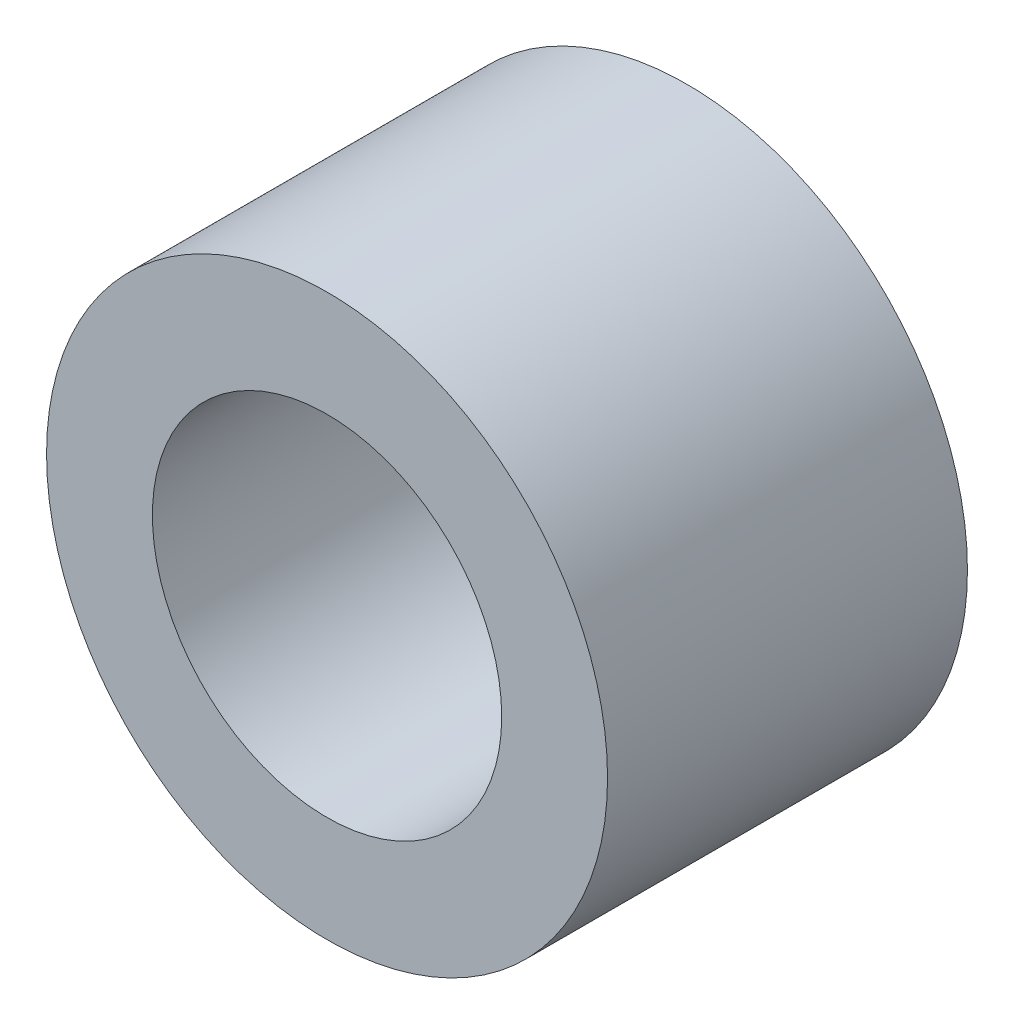
ISO-10303-21;
HEADER;
FILE_DESCRIPTION(('STEP AP214'),'2;1');
FILE_NAME('part.step','',(''),(''),'','','');
FILE_SCHEMA(('AUTOMOTIVE_DESIGN { 1 0 10303 214 1 1 1 1 }'));
ENDSEC;
DATA;
#1=APPLICATION_CONTEXT('core data for automotive mechanical design processes');
#2=APPLICATION_PROTOCOL_DEFINITION('international standard','automotive_design',2000,#1);
#3=PRODUCT_CONTEXT('',#1,'mechanical');
#4=PRODUCT('Part','Part','',(#3));
#5=PRODUCT_RELATED_PRODUCT_CATEGORY('part','',(#4));
#6=PRODUCT_DEFINITION_FORMATION('','',#4);
#7=PRODUCT_DEFINITION_CONTEXT('part definition',#1,'design');
#8=PRODUCT_DEFINITION('design','',#6,#7);
#9=PRODUCT_DEFINITION_SHAPE('','',#8);
#10=(LENGTH_UNIT() NAMED_UNIT(*) SI_UNIT(.MILLI.,.METRE.));
#11=(NAMED_UNIT(*) PLANE_ANGLE_UNIT() SI_UNIT($,.RADIAN.));
#12=(NAMED_UNIT(*) SI_UNIT($,.STERADIAN.) SOLID_ANGLE_UNIT());
#13=UNCERTAINTY_MEASURE_WITH_UNIT(LENGTH_MEASURE(1.E-05),#10,'distance_accuracy_value','');
#14=(GEOMETRIC_REPRESENTATION_CONTEXT(3) GLOBAL_UNCERTAINTY_ASSIGNED_CONTEXT((#13)) GLOBAL_UNIT_ASSIGNED_CONTEXT((#10,
#11,#12)) REPRESENTATION_CONTEXT('',''));
#15=CARTESIAN_POINT('',(0.,0.,0.));
#16=DIRECTION('',(0.,0.,1.));
#17=DIRECTION('',(1.,0.,0.));
#18=AXIS2_PLACEMENT_3D('',#15,#16,#17);
#19=CARTESIAN_POINT('',(0.,0.,3.4));
#20=DIRECTION('',(0.,0.,1.));
#21=DIRECTION('',(1.,0.,0.));
#22=AXIS2_PLACEMENT_3D('',#19,#20,#21);
#23=PLANE('',#22);
#24=CARTESIAN_POINT('',(0.,0.,3.4));
#25=DIRECTION('',(0.,0.,1.));
#26=DIRECTION('',(1.,0.,0.));
#27=AXIS2_PLACEMENT_3D('',#24,#25,#26);
#28=CIRCLE('',#27,2.65);
#29=CARTESIAN_POINT('',(2.65,0.,3.4));
#30=VERTEX_POINT('',#29);
#31=EDGE_CURVE('E10',#30,#30,#28,.T.);
#32=ORIENTED_EDGE('',*,*,#31,.T.);
#33=EDGE_LOOP('',(#32));
#34=FACE_BOUND('',#33,.T.);
#35=CARTESIAN_POINT('',(0.,0.,3.4));
#36=DIRECTION('',(0.,0.,1.));
#37=DIRECTION('',(1.,0.,0.));
#38=AXIS2_PLACEMENT_3D('',#35,#36,#37);
#39=CIRCLE('',#38,1.65);
#40=CARTESIAN_POINT('',(1.65,0.,3.4));
#41=VERTEX_POINT('',#40);
#42=EDGE_CURVE('E48',#41,#41,#39,.T.);
#43=ORIENTED_EDGE('',*,*,#42,.F.);
#44=EDGE_LOOP('',(#43));
#45=FACE_BOUND('',#44,.T.);
#46=ADVANCED_FACE('F37',(#34,#45),#23,.T.);
#47=CARTESIAN_POINT('',(0.,0.,0.));
#48=DIRECTION('',(0.,0.,1.));
#49=DIRECTION('',(1.,0.,0.));
#50=AXIS2_PLACEMENT_3D('',#47,#48,#49);
#51=PLANE('',#50);
#52=CARTESIAN_POINT('',(0.,0.,0.));
#53=DIRECTION('',(0.,0.,1.));
#54=DIRECTION('',(1.,0.,0.));
#55=AXIS2_PLACEMENT_3D('',#52,#53,#54);
#56=CIRCLE('',#55,2.65);
#57=CARTESIAN_POINT('',(2.65,0.,0.));
#58=VERTEX_POINT('',#57);
#59=EDGE_CURVE('E41',#58,#58,#56,.T.);
#60=ORIENTED_EDGE('',*,*,#59,.F.);
#61=EDGE_LOOP('',(#60));
#62=FACE_BOUND('',#61,.T.);
#63=CARTESIAN_POINT('',(0.,0.,0.));
#64=DIRECTION('',(0.,0.,1.));
#65=DIRECTION('',(1.,0.,0.));
#66=AXIS2_PLACEMENT_3D('',#63,#64,#65);
#67=CIRCLE('',#66,1.65);
#68=CARTESIAN_POINT('',(1.65,0.,0.));
#69=VERTEX_POINT('',#68);
#70=EDGE_CURVE('E50',#69,#69,#67,.T.);
#71=ORIENTED_EDGE('',*,*,#70,.T.);
#72=EDGE_LOOP('',(#71));
#73=FACE_BOUND('',#72,.T.);
#74=ADVANCED_FACE('F60',(#62,#73),#51,.F.);
#75=CARTESIAN_POINT('',(0.,0.,3.4));
#76=DIRECTION('',(0.,0.,-1.));
#77=DIRECTION('',(-1.,0.,0.));
#78=AXIS2_PLACEMENT_3D('',#75,#76,#77);
#79=CYLINDRICAL_SURFACE('',#78,2.65);
#80=ORIENTED_EDGE('',*,*,#31,.F.);
#81=EDGE_LOOP('',(#80));
#82=FACE_BOUND('',#81,.T.);
#83=ORIENTED_EDGE('',*,*,#59,.T.);
#84=EDGE_LOOP('',(#83));
#85=FACE_BOUND('',#84,.T.);
#86=ADVANCED_FACE('F39',(#82,#85),#79,.T.);
#87=CARTESIAN_POINT('',(0.,0.,3.4));
#88=DIRECTION('',(0.,0.,-1.));
#89=DIRECTION('',(-1.,0.,0.));
#90=AXIS2_PLACEMENT_3D('',#87,#88,#89);
#91=CYLINDRICAL_SURFACE('',#90,1.65);
#92=ORIENTED_EDGE('',*,*,#42,.T.);
#93=EDGE_LOOP('',(#92));
#94=FACE_BOUND('',#93,.T.);
#95=ORIENTED_EDGE('',*,*,#70,.F.);
#96=EDGE_LOOP('',(#95));
#97=FACE_BOUND('',#96,.T.);
#98=ADVANCED_FACE('F56',(#94,#97),#91,.F.);
#99=CLOSED_SHELL('',(#46,#74,#86,#98));
#100=MANIFOLD_SOLID_BREP('B2',#99);
#101=ADVANCED_BREP_SHAPE_REPRESENTATION('',(#18,#100),#14);
#102=SHAPE_DEFINITION_REPRESENTATION(#9,#101);
ENDSEC;
END-ISO-10303-21;
